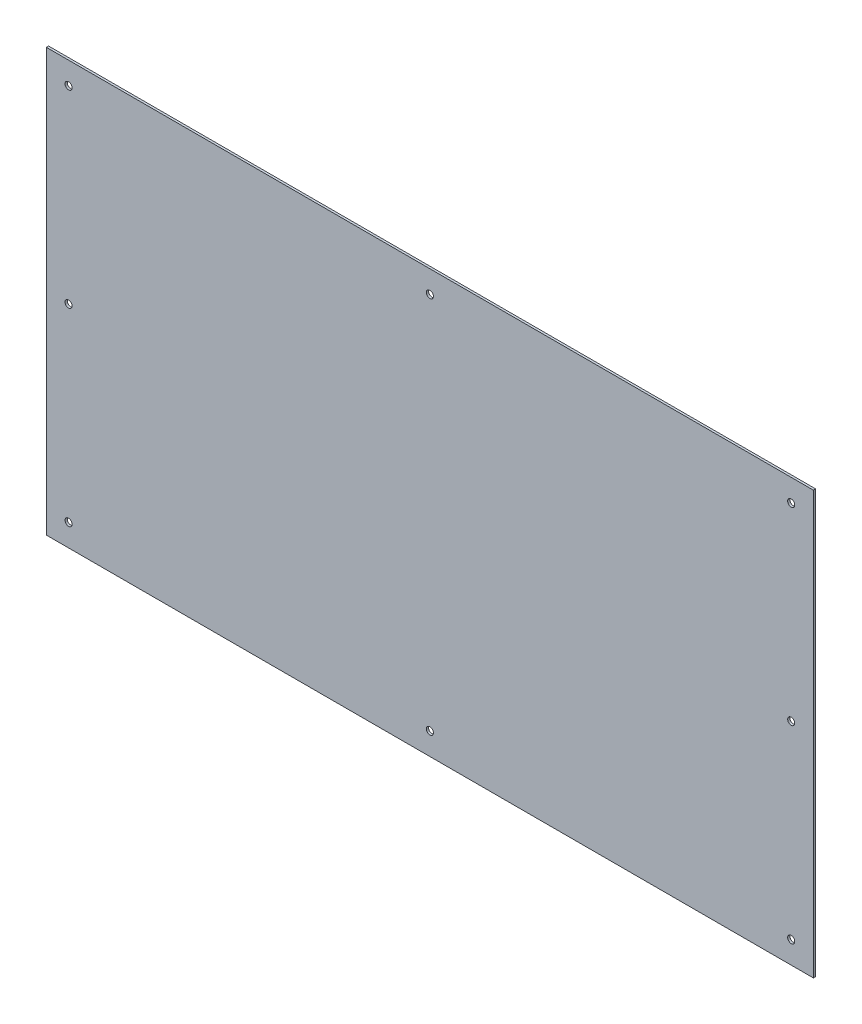
ISO-10303-21;
HEADER;
FILE_DESCRIPTION(('STEP AP214'),'2;1');
FILE_NAME('part.step','',(''),(''),'','','');
FILE_SCHEMA(('AUTOMOTIVE_DESIGN { 1 0 10303 214 1 1 1 1 }'));
ENDSEC;
DATA;
#1=APPLICATION_CONTEXT('core data for automotive mechanical design processes');
#2=APPLICATION_PROTOCOL_DEFINITION('international standard','automotive_design',2000,#1);
#3=PRODUCT_CONTEXT('',#1,'mechanical');
#4=PRODUCT('Part','Part','',(#3));
#5=PRODUCT_RELATED_PRODUCT_CATEGORY('part','',(#4));
#6=PRODUCT_DEFINITION_FORMATION('','',#4);
#7=PRODUCT_DEFINITION_CONTEXT('part definition',#1,'design');
#8=PRODUCT_DEFINITION('design','',#6,#7);
#9=PRODUCT_DEFINITION_SHAPE('','',#8);
#10=(LENGTH_UNIT() NAMED_UNIT(*) SI_UNIT(.MILLI.,.METRE.));
#11=(NAMED_UNIT(*) PLANE_ANGLE_UNIT() SI_UNIT($,.RADIAN.));
#12=(NAMED_UNIT(*) SI_UNIT($,.STERADIAN.) SOLID_ANGLE_UNIT());
#13=UNCERTAINTY_MEASURE_WITH_UNIT(LENGTH_MEASURE(1.E-05),#10,'distance_accuracy_value','');
#14=(GEOMETRIC_REPRESENTATION_CONTEXT(3) GLOBAL_UNCERTAINTY_ASSIGNED_CONTEXT((#13)) GLOBAL_UNIT_ASSIGNED_CONTEXT((#10,
#11,#12)) REPRESENTATION_CONTEXT('',''));
#15=CARTESIAN_POINT('',(0.,0.,0.));
#16=DIRECTION('',(0.,0.,1.));
#17=DIRECTION('',(1.,0.,0.));
#18=AXIS2_PLACEMENT_3D('',#15,#16,#17);
#19=CARTESIAN_POINT('',(278.,-187.,2.));
#20=DIRECTION('',(-1.,0.,0.));
#21=DIRECTION('',(0.,0.,1.));
#22=AXIS2_PLACEMENT_3D('',#19,#20,#21);
#23=PLANE('',#22);
#24=DIRECTION('',(0.,1.,0.));
#25=VECTOR('',#24,1.);
#26=CARTESIAN_POINT('',(278.,-187.,0.));
#27=LINE('',#26,#25);
#28=CARTESIAN_POINT('',(278.,-187.,0.));
#29=VERTEX_POINT('',#28);
#30=CARTESIAN_POINT('',(278.,193.,0.));
#31=VERTEX_POINT('',#30);
#32=EDGE_CURVE('E98',#29,#31,#27,.T.);
#33=ORIENTED_EDGE('',*,*,#32,.T.);
#34=DIRECTION('',(0.,0.,-1.));
#35=VECTOR('',#34,1.);
#36=CARTESIAN_POINT('',(278.,193.,2.));
#37=LINE('',#36,#35);
#38=CARTESIAN_POINT('',(278.,193.,2.));
#39=VERTEX_POINT('',#38);
#40=EDGE_CURVE('E11',#39,#31,#37,.T.);
#41=ORIENTED_EDGE('',*,*,#40,.F.);
#42=DIRECTION('',(0.,1.,0.));
#43=VECTOR('',#42,1.);
#44=CARTESIAN_POINT('',(278.,-187.,2.));
#45=LINE('',#44,#43);
#46=CARTESIAN_POINT('',(278.,-187.,2.));
#47=VERTEX_POINT('',#46);
#48=EDGE_CURVE('E85',#47,#39,#45,.T.);
#49=ORIENTED_EDGE('',*,*,#48,.F.);
#50=DIRECTION('',(0.,0.,-1.));
#51=VECTOR('',#50,1.);
#52=CARTESIAN_POINT('',(278.,-187.,2.));
#53=LINE('',#52,#51);
#54=EDGE_CURVE('E94',#47,#29,#53,.T.);
#55=ORIENTED_EDGE('',*,*,#54,.T.);
#56=EDGE_LOOP('',(#33,#41,#49,#55));
#57=FACE_BOUND('',#56,.T.);
#58=ADVANCED_FACE('F32',(#57),#23,.F.);
#59=CARTESIAN_POINT('',(-412.,193.,2.));
#60=DIRECTION('',(0.,-1.,0.));
#61=DIRECTION('',(0.,0.,-1.));
#62=AXIS2_PLACEMENT_3D('',#59,#60,#61);
#63=PLANE('',#62);
#64=DIRECTION('',(-1.,0.,0.));
#65=VECTOR('',#64,1.);
#66=CARTESIAN_POINT('',(-412.,193.,0.));
#67=LINE('',#66,#65);
#68=CARTESIAN_POINT('',(-412.,193.,0.));
#69=VERTEX_POINT('',#68);
#70=EDGE_CURVE('E89',#31,#69,#67,.T.);
#71=ORIENTED_EDGE('',*,*,#70,.T.);
#72=DIRECTION('',(0.,0.,-1.));
#73=VECTOR('',#72,1.);
#74=CARTESIAN_POINT('',(-412.,193.,2.));
#75=LINE('',#74,#73);
#76=CARTESIAN_POINT('',(-412.,193.,2.));
#77=VERTEX_POINT('',#76);
#78=EDGE_CURVE('E41',#77,#69,#75,.T.);
#79=ORIENTED_EDGE('',*,*,#78,.F.);
#80=DIRECTION('',(-1.,0.,0.));
#81=VECTOR('',#80,1.);
#82=CARTESIAN_POINT('',(-412.,193.,2.));
#83=LINE('',#82,#81);
#84=EDGE_CURVE('E80',#39,#77,#83,.T.);
#85=ORIENTED_EDGE('',*,*,#84,.F.);
#86=ORIENTED_EDGE('',*,*,#40,.T.);
#87=EDGE_LOOP('',(#71,#79,#85,#86));
#88=FACE_BOUND('',#87,.T.);
#89=ADVANCED_FACE('F88',(#88),#63,.F.);
#90=CARTESIAN_POINT('',(-412.,-187.,2.));
#91=DIRECTION('',(1.,0.,0.));
#92=DIRECTION('',(0.,0.,-1.));
#93=AXIS2_PLACEMENT_3D('',#90,#91,#92);
#94=PLANE('',#93);
#95=DIRECTION('',(0.,-1.,0.));
#96=VECTOR('',#95,1.);
#97=CARTESIAN_POINT('',(-412.,-187.,0.));
#98=LINE('',#97,#96);
#99=CARTESIAN_POINT('',(-412.,-187.,0.));
#100=VERTEX_POINT('',#99);
#101=EDGE_CURVE('E67',#69,#100,#98,.T.);
#102=ORIENTED_EDGE('',*,*,#101,.T.);
#103=DIRECTION('',(0.,0.,-1.));
#104=VECTOR('',#103,1.);
#105=CARTESIAN_POINT('',(-412.,-187.,2.));
#106=LINE('',#105,#104);
#107=CARTESIAN_POINT('',(-412.,-187.,2.));
#108=VERTEX_POINT('',#107);
#109=EDGE_CURVE('E90',#108,#100,#106,.T.);
#110=ORIENTED_EDGE('',*,*,#109,.F.);
#111=DIRECTION('',(0.,-1.,0.));
#112=VECTOR('',#111,1.);
#113=CARTESIAN_POINT('',(-412.,-187.,2.));
#114=LINE('',#113,#112);
#115=EDGE_CURVE('E83',#77,#108,#114,.T.);
#116=ORIENTED_EDGE('',*,*,#115,.F.);
#117=ORIENTED_EDGE('',*,*,#78,.T.);
#118=EDGE_LOOP('',(#102,#110,#116,#117));
#119=FACE_BOUND('',#118,.T.);
#120=ADVANCED_FACE('F92',(#119),#94,.F.);
#121=CARTESIAN_POINT('',(-412.,-187.,2.));
#122=DIRECTION('',(0.,1.,0.));
#123=DIRECTION('',(0.,0.,1.));
#124=AXIS2_PLACEMENT_3D('',#121,#122,#123);
#125=PLANE('',#124);
#126=DIRECTION('',(1.,0.,0.));
#127=VECTOR('',#126,1.);
#128=CARTESIAN_POINT('',(-412.,-187.,0.));
#129=LINE('',#128,#127);
#130=EDGE_CURVE('E73',#100,#29,#129,.T.);
#131=ORIENTED_EDGE('',*,*,#130,.T.);
#132=ORIENTED_EDGE('',*,*,#54,.F.);
#133=DIRECTION('',(1.,0.,0.));
#134=VECTOR('',#133,1.);
#135=CARTESIAN_POINT('',(-412.,-187.,2.));
#136=LINE('',#135,#134);
#137=EDGE_CURVE('E50',#108,#47,#136,.T.);
#138=ORIENTED_EDGE('',*,*,#137,.F.);
#139=ORIENTED_EDGE('',*,*,#109,.T.);
#140=EDGE_LOOP('',(#131,#132,#138,#139));
#141=FACE_BOUND('',#140,.T.);
#142=ADVANCED_FACE('F163',(#141),#125,.F.);
#143=CARTESIAN_POINT('',(0.,0.,2.));
#144=DIRECTION('',(0.,0.,-1.));
#145=DIRECTION('',(-1.,0.,0.));
#146=AXIS2_PLACEMENT_3D('',#143,#144,#145);
#147=PLANE('',#146);
#148=CARTESIAN_POINT('',(-392.,3.,2.));
#149=DIRECTION('',(0.,0.,1.));
#150=DIRECTION('',(1.,0.,0.));
#151=AXIS2_PLACEMENT_3D('',#148,#149,#150);
#152=CIRCLE('',#151,3.17499999999997);
#153=CARTESIAN_POINT('',(-388.825,3.,2.));
#154=VERTEX_POINT('',#153);
#155=EDGE_CURVE('E141',#154,#154,#152,.T.);
#156=ORIENTED_EDGE('',*,*,#155,.F.);
#157=EDGE_LOOP('',(#156));
#158=FACE_BOUND('',#157,.T.);
#159=CARTESIAN_POINT('',(258.,3.,2.));
#160=DIRECTION('',(0.,0.,1.));
#161=DIRECTION('',(-1.,0.,0.));
#162=AXIS2_PLACEMENT_3D('',#159,#160,#161);
#163=CIRCLE('',#162,3.17499999999997);
#164=CARTESIAN_POINT('',(254.825,3.,2.));
#165=VERTEX_POINT('',#164);
#166=EDGE_CURVE('E146',#165,#165,#163,.T.);
#167=ORIENTED_EDGE('',*,*,#166,.F.);
#168=EDGE_LOOP('',(#167));
#169=FACE_BOUND('',#168,.T.);
#170=CARTESIAN_POINT('',(-66.9999999999999,173.,2.));
#171=DIRECTION('',(0.,0.,1.));
#172=DIRECTION('',(1.,0.,0.));
#173=AXIS2_PLACEMENT_3D('',#170,#171,#172);
#174=CIRCLE('',#173,3.175);
#175=CARTESIAN_POINT('',(-63.825,173.,2.));
#176=VERTEX_POINT('',#175);
#177=EDGE_CURVE('E149',#176,#176,#174,.T.);
#178=ORIENTED_EDGE('',*,*,#177,.F.);
#179=EDGE_LOOP('',(#178));
#180=FACE_BOUND('',#179,.T.);
#181=CARTESIAN_POINT('',(-66.9999999999999,-167.,2.));
#182=DIRECTION('',(0.,0.,1.));
#183=DIRECTION('',(-1.,0.,0.));
#184=AXIS2_PLACEMENT_3D('',#181,#182,#183);
#185=CIRCLE('',#184,3.175);
#186=CARTESIAN_POINT('',(-70.1749999999999,-167.,2.));
#187=VERTEX_POINT('',#186);
#188=EDGE_CURVE('E152',#187,#187,#185,.T.);
#189=ORIENTED_EDGE('',*,*,#188,.F.);
#190=EDGE_LOOP('',(#189));
#191=FACE_BOUND('',#190,.T.);
#192=CARTESIAN_POINT('',(-392.,-167.,2.));
#193=DIRECTION('',(0.,0.,1.));
#194=DIRECTION('',(-1.,0.,0.));
#195=AXIS2_PLACEMENT_3D('',#192,#193,#194);
#196=CIRCLE('',#195,3.17499999999998);
#197=CARTESIAN_POINT('',(-395.175,-167.,2.));
#198=VERTEX_POINT('',#197);
#199=EDGE_CURVE('E137',#198,#198,#196,.T.);
#200=ORIENTED_EDGE('',*,*,#199,.F.);
#201=EDGE_LOOP('',(#200));
#202=FACE_BOUND('',#201,.T.);
#203=CARTESIAN_POINT('',(258.,-167.,2.));
#204=DIRECTION('',(0.,0.,1.));
#205=DIRECTION('',(1.,0.,0.));
#206=AXIS2_PLACEMENT_3D('',#203,#204,#205);
#207=CIRCLE('',#206,3.17500000000003);
#208=CARTESIAN_POINT('',(261.175,-167.,2.));
#209=VERTEX_POINT('',#208);
#210=EDGE_CURVE('E140',#209,#209,#207,.T.);
#211=ORIENTED_EDGE('',*,*,#210,.F.);
#212=EDGE_LOOP('',(#211));
#213=FACE_BOUND('',#212,.T.);
#214=CARTESIAN_POINT('',(258.,173.,2.));
#215=DIRECTION('',(0.,0.,1.));
#216=DIRECTION('',(-1.,0.,0.));
#217=AXIS2_PLACEMENT_3D('',#214,#215,#216);
#218=CIRCLE('',#217,3.17500000000002);
#219=CARTESIAN_POINT('',(254.825,173.,2.));
#220=VERTEX_POINT('',#219);
#221=EDGE_CURVE('E114',#220,#220,#218,.T.);
#222=ORIENTED_EDGE('',*,*,#221,.F.);
#223=EDGE_LOOP('',(#222));
#224=FACE_BOUND('',#223,.T.);
#225=CARTESIAN_POINT('',(-392.,173.,2.));
#226=DIRECTION('',(0.,0.,1.));
#227=DIRECTION('',(1.,0.,0.));
#228=AXIS2_PLACEMENT_3D('',#225,#226,#227);
#229=CIRCLE('',#228,3.17499999999997);
#230=CARTESIAN_POINT('',(-388.825,173.,2.));
#231=VERTEX_POINT('',#230);
#232=EDGE_CURVE('E109',#231,#231,#229,.T.);
#233=ORIENTED_EDGE('',*,*,#232,.F.);
#234=EDGE_LOOP('',(#233));
#235=FACE_BOUND('',#234,.T.);
#236=ORIENTED_EDGE('',*,*,#48,.T.);
#237=ORIENTED_EDGE('',*,*,#84,.T.);
#238=ORIENTED_EDGE('',*,*,#115,.T.);
#239=ORIENTED_EDGE('',*,*,#137,.T.);
#240=EDGE_LOOP('',(#236,#237,#238,#239));
#241=FACE_BOUND('',#240,.T.);
#242=ADVANCED_FACE('F81',(#158,#169,#180,#191,#202,#213,#224,#235,#241),#147,.F.);
#243=CARTESIAN_POINT('',(0.,0.,0.));
#244=DIRECTION('',(0.,0.,-1.));
#245=DIRECTION('',(-1.,0.,0.));
#246=AXIS2_PLACEMENT_3D('',#243,#244,#245);
#247=PLANE('',#246);
#248=CARTESIAN_POINT('',(-392.,3.,0.));
#249=DIRECTION('',(0.,0.,-1.));
#250=DIRECTION('',(-1.,0.,0.));
#251=AXIS2_PLACEMENT_3D('',#248,#249,#250);
#252=CIRCLE('',#251,3.17499999999997);
#253=CARTESIAN_POINT('',(-395.175,3.,0.));
#254=VERTEX_POINT('',#253);
#255=EDGE_CURVE('E35',#254,#254,#252,.T.);
#256=ORIENTED_EDGE('',*,*,#255,.F.);
#257=EDGE_LOOP('',(#256));
#258=FACE_BOUND('',#257,.T.);
#259=CARTESIAN_POINT('',(258.,3.,0.));
#260=DIRECTION('',(0.,0.,-1.));
#261=DIRECTION('',(-1.,0.,0.));
#262=AXIS2_PLACEMENT_3D('',#259,#260,#261);
#263=CIRCLE('',#262,3.17499999999997);
#264=CARTESIAN_POINT('',(254.825,3.,0.));
#265=VERTEX_POINT('',#264);
#266=EDGE_CURVE('E125',#265,#265,#263,.T.);
#267=ORIENTED_EDGE('',*,*,#266,.F.);
#268=EDGE_LOOP('',(#267));
#269=FACE_BOUND('',#268,.T.);
#270=CARTESIAN_POINT('',(-66.9999999999999,173.,0.));
#271=DIRECTION('',(0.,0.,-1.));
#272=DIRECTION('',(-1.,0.,0.));
#273=AXIS2_PLACEMENT_3D('',#270,#271,#272);
#274=CIRCLE('',#273,3.175);
#275=CARTESIAN_POINT('',(-70.1749999999999,173.,0.));
#276=VERTEX_POINT('',#275);
#277=EDGE_CURVE('E123',#276,#276,#274,.T.);
#278=ORIENTED_EDGE('',*,*,#277,.F.);
#279=EDGE_LOOP('',(#278));
#280=FACE_BOUND('',#279,.T.);
#281=CARTESIAN_POINT('',(-66.9999999999999,-167.,0.));
#282=DIRECTION('',(0.,0.,-1.));
#283=DIRECTION('',(-1.,0.,0.));
#284=AXIS2_PLACEMENT_3D('',#281,#282,#283);
#285=CIRCLE('',#284,3.175);
#286=CARTESIAN_POINT('',(-70.1749999999999,-167.,0.));
#287=VERTEX_POINT('',#286);
#288=EDGE_CURVE('E120',#287,#287,#285,.T.);
#289=ORIENTED_EDGE('',*,*,#288,.F.);
#290=EDGE_LOOP('',(#289));
#291=FACE_BOUND('',#290,.T.);
#292=CARTESIAN_POINT('',(-392.,-167.,0.));
#293=DIRECTION('',(0.,0.,-1.));
#294=DIRECTION('',(-1.,0.,0.));
#295=AXIS2_PLACEMENT_3D('',#292,#293,#294);
#296=CIRCLE('',#295,3.17499999999998);
#297=CARTESIAN_POINT('',(-395.175,-167.,0.));
#298=VERTEX_POINT('',#297);
#299=EDGE_CURVE('E117',#298,#298,#296,.T.);
#300=ORIENTED_EDGE('',*,*,#299,.F.);
#301=EDGE_LOOP('',(#300));
#302=FACE_BOUND('',#301,.T.);
#303=CARTESIAN_POINT('',(258.,-167.,0.));
#304=DIRECTION('',(0.,0.,-1.));
#305=DIRECTION('',(-1.,0.,0.));
#306=AXIS2_PLACEMENT_3D('',#303,#304,#305);
#307=CIRCLE('',#306,3.17500000000003);
#308=CARTESIAN_POINT('',(254.825,-167.,0.));
#309=VERTEX_POINT('',#308);
#310=EDGE_CURVE('E113',#309,#309,#307,.T.);
#311=ORIENTED_EDGE('',*,*,#310,.F.);
#312=EDGE_LOOP('',(#311));
#313=FACE_BOUND('',#312,.T.);
#314=CARTESIAN_POINT('',(258.,173.,0.));
#315=DIRECTION('',(0.,0.,-1.));
#316=DIRECTION('',(-1.,0.,0.));
#317=AXIS2_PLACEMENT_3D('',#314,#315,#316);
#318=CIRCLE('',#317,3.17500000000002);
#319=CARTESIAN_POINT('',(254.825,173.,0.));
#320=VERTEX_POINT('',#319);
#321=EDGE_CURVE('E110',#320,#320,#318,.T.);
#322=ORIENTED_EDGE('',*,*,#321,.F.);
#323=EDGE_LOOP('',(#322));
#324=FACE_BOUND('',#323,.T.);
#325=CARTESIAN_POINT('',(-392.,173.,0.));
#326=DIRECTION('',(0.,0.,-1.));
#327=DIRECTION('',(-1.,0.,0.));
#328=AXIS2_PLACEMENT_3D('',#325,#326,#327);
#329=CIRCLE('',#328,3.17499999999997);
#330=CARTESIAN_POINT('',(-395.175,173.,0.));
#331=VERTEX_POINT('',#330);
#332=EDGE_CURVE('E101',#331,#331,#329,.T.);
#333=ORIENTED_EDGE('',*,*,#332,.F.);
#334=EDGE_LOOP('',(#333));
#335=FACE_BOUND('',#334,.T.);
#336=ORIENTED_EDGE('',*,*,#32,.F.);
#337=ORIENTED_EDGE('',*,*,#130,.F.);
#338=ORIENTED_EDGE('',*,*,#101,.F.);
#339=ORIENTED_EDGE('',*,*,#70,.F.);
#340=EDGE_LOOP('',(#336,#337,#338,#339));
#341=FACE_BOUND('',#340,.T.);
#342=ADVANCED_FACE('F162',(#258,#269,#280,#291,#302,#313,#324,#335,#341),#247,.T.);
#343=CARTESIAN_POINT('',(-392.,173.,-8.));
#344=DIRECTION('',(0.,0.,1.));
#345=DIRECTION('',(1.,0.,0.));
#346=AXIS2_PLACEMENT_3D('',#343,#344,#345);
#347=CYLINDRICAL_SURFACE('',#346,3.17499999999997);
#348=ORIENTED_EDGE('',*,*,#332,.T.);
#349=EDGE_LOOP('',(#348));
#350=FACE_BOUND('',#349,.T.);
#351=ORIENTED_EDGE('',*,*,#232,.T.);
#352=EDGE_LOOP('',(#351));
#353=FACE_BOUND('',#352,.T.);
#354=ADVANCED_FACE('F178',(#350,#353),#347,.F.);
#355=CARTESIAN_POINT('',(258.,173.,-8.));
#356=DIRECTION('',(0.,0.,1.));
#357=DIRECTION('',(1.,0.,0.));
#358=AXIS2_PLACEMENT_3D('',#355,#356,#357);
#359=CYLINDRICAL_SURFACE('',#358,3.17500000000002);
#360=ORIENTED_EDGE('',*,*,#321,.T.);
#361=EDGE_LOOP('',(#360));
#362=FACE_BOUND('',#361,.T.);
#363=ORIENTED_EDGE('',*,*,#221,.T.);
#364=EDGE_LOOP('',(#363));
#365=FACE_BOUND('',#364,.T.);
#366=ADVANCED_FACE('F175',(#362,#365),#359,.F.);
#367=CARTESIAN_POINT('',(258.,-167.,-8.));
#368=DIRECTION('',(0.,0.,1.));
#369=DIRECTION('',(1.,0.,0.));
#370=AXIS2_PLACEMENT_3D('',#367,#368,#369);
#371=CYLINDRICAL_SURFACE('',#370,3.17500000000003);
#372=ORIENTED_EDGE('',*,*,#310,.T.);
#373=EDGE_LOOP('',(#372));
#374=FACE_BOUND('',#373,.T.);
#375=ORIENTED_EDGE('',*,*,#210,.T.);
#376=EDGE_LOOP('',(#375));
#377=FACE_BOUND('',#376,.T.);
#378=ADVANCED_FACE('F177',(#374,#377),#371,.F.);
#379=CARTESIAN_POINT('',(-392.,-167.,-8.));
#380=DIRECTION('',(0.,0.,1.));
#381=DIRECTION('',(1.,0.,0.));
#382=AXIS2_PLACEMENT_3D('',#379,#380,#381);
#383=CYLINDRICAL_SURFACE('',#382,3.17499999999998);
#384=ORIENTED_EDGE('',*,*,#299,.T.);
#385=EDGE_LOOP('',(#384));
#386=FACE_BOUND('',#385,.T.);
#387=ORIENTED_EDGE('',*,*,#199,.T.);
#388=EDGE_LOOP('',(#387));
#389=FACE_BOUND('',#388,.T.);
#390=ADVANCED_FACE('F185',(#386,#389),#383,.F.);
#391=CARTESIAN_POINT('',(-66.9999999999999,-167.,-8.));
#392=DIRECTION('',(0.,0.,1.));
#393=DIRECTION('',(1.,0.,0.));
#394=AXIS2_PLACEMENT_3D('',#391,#392,#393);
#395=CYLINDRICAL_SURFACE('',#394,3.175);
#396=ORIENTED_EDGE('',*,*,#288,.T.);
#397=EDGE_LOOP('',(#396));
#398=FACE_BOUND('',#397,.T.);
#399=ORIENTED_EDGE('',*,*,#188,.T.);
#400=EDGE_LOOP('',(#399));
#401=FACE_BOUND('',#400,.T.);
#402=ADVANCED_FACE('F249',(#398,#401),#395,.F.);
#403=CARTESIAN_POINT('',(-66.9999999999999,173.,-8.));
#404=DIRECTION('',(0.,0.,1.));
#405=DIRECTION('',(1.,0.,0.));
#406=AXIS2_PLACEMENT_3D('',#403,#404,#405);
#407=CYLINDRICAL_SURFACE('',#406,3.175);
#408=ORIENTED_EDGE('',*,*,#277,.T.);
#409=EDGE_LOOP('',(#408));
#410=FACE_BOUND('',#409,.T.);
#411=ORIENTED_EDGE('',*,*,#177,.T.);
#412=EDGE_LOOP('',(#411));
#413=FACE_BOUND('',#412,.T.);
#414=ADVANCED_FACE('F158',(#410,#413),#407,.F.);
#415=CARTESIAN_POINT('',(258.,3.,-8.));
#416=DIRECTION('',(0.,0.,1.));
#417=DIRECTION('',(1.,0.,0.));
#418=AXIS2_PLACEMENT_3D('',#415,#416,#417);
#419=CYLINDRICAL_SURFACE('',#418,3.17499999999997);
#420=ORIENTED_EDGE('',*,*,#266,.T.);
#421=EDGE_LOOP('',(#420));
#422=FACE_BOUND('',#421,.T.);
#423=ORIENTED_EDGE('',*,*,#166,.T.);
#424=EDGE_LOOP('',(#423));
#425=FACE_BOUND('',#424,.T.);
#426=ADVANCED_FACE('F268',(#422,#425),#419,.F.);
#427=CARTESIAN_POINT('',(-392.,3.,-8.));
#428=DIRECTION('',(0.,0.,1.));
#429=DIRECTION('',(1.,0.,0.));
#430=AXIS2_PLACEMENT_3D('',#427,#428,#429);
#431=CYLINDRICAL_SURFACE('',#430,3.17499999999997);
#432=ORIENTED_EDGE('',*,*,#255,.T.);
#433=EDGE_LOOP('',(#432));
#434=FACE_BOUND('',#433,.T.);
#435=ORIENTED_EDGE('',*,*,#155,.T.);
#436=EDGE_LOOP('',(#435));
#437=FACE_BOUND('',#436,.T.);
#438=ADVANCED_FACE('F278',(#434,#437),#431,.F.);
#439=CLOSED_SHELL('',(#58,#89,#120,#142,#242,#342,#354,#366,#378,#390,#402,#414,#426,#438));
#440=MANIFOLD_SOLID_BREP('B2',#439);
#441=ADVANCED_BREP_SHAPE_REPRESENTATION('',(#18,#440),#14);
#442=SHAPE_DEFINITION_REPRESENTATION(#9,#441);
ENDSEC;
END-ISO-10303-21;
